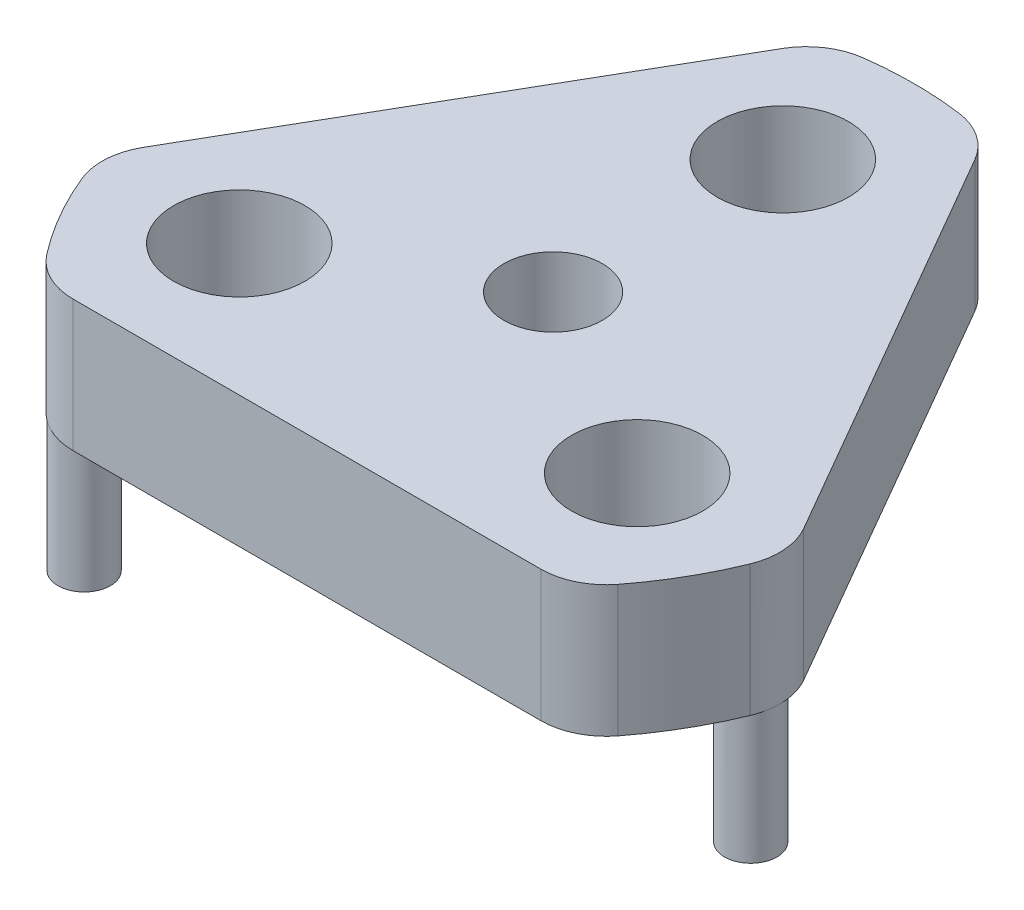
ISO-10303-21;
HEADER;
FILE_DESCRIPTION(('STEP AP214'),'2;1');
FILE_NAME('part.step','',(''),(''),'','','');
FILE_SCHEMA(('AUTOMOTIVE_DESIGN { 1 0 10303 214 1 1 1 1 }'));
ENDSEC;
DATA;
#1=APPLICATION_CONTEXT('core data for automotive mechanical design processes');
#2=APPLICATION_PROTOCOL_DEFINITION('international standard','automotive_design',2000,#1);
#3=PRODUCT_CONTEXT('',#1,'mechanical');
#4=PRODUCT('Part','Part','',(#3));
#5=PRODUCT_RELATED_PRODUCT_CATEGORY('part','',(#4));
#6=PRODUCT_DEFINITION_FORMATION('','',#4);
#7=PRODUCT_DEFINITION_CONTEXT('part definition',#1,'design');
#8=PRODUCT_DEFINITION('design','',#6,#7);
#9=PRODUCT_DEFINITION_SHAPE('','',#8);
#10=(LENGTH_UNIT() NAMED_UNIT(*) SI_UNIT(.MILLI.,.METRE.));
#11=(NAMED_UNIT(*) PLANE_ANGLE_UNIT() SI_UNIT($,.RADIAN.));
#12=(NAMED_UNIT(*) SI_UNIT($,.STERADIAN.) SOLID_ANGLE_UNIT());
#13=UNCERTAINTY_MEASURE_WITH_UNIT(LENGTH_MEASURE(1.E-05),#10,'distance_accuracy_value','');
#14=(GEOMETRIC_REPRESENTATION_CONTEXT(3) GLOBAL_UNCERTAINTY_ASSIGNED_CONTEXT((#13)) GLOBAL_UNIT_ASSIGNED_CONTEXT((#10,
#11,#12)) REPRESENTATION_CONTEXT('',''));
#15=CARTESIAN_POINT('',(0.,0.,0.));
#16=DIRECTION('',(0.,0.,1.));
#17=DIRECTION('',(1.,0.,0.));
#18=AXIS2_PLACEMENT_3D('',#15,#16,#17);
#19=CARTESIAN_POINT('',(0.,10.,18.75));
#20=DIRECTION('',(0.,0.,-1.));
#21=DIRECTION('',(-1.,0.,0.));
#22=AXIS2_PLACEMENT_3D('',#19,#20,#21);
#23=PLANE('',#22);
#24=DIRECTION('',(1.,0.,0.));
#25=VECTOR('',#24,1.);
#26=CARTESIAN_POINT('',(0.,0.,18.75));
#27=LINE('',#26,#25);
#28=CARTESIAN_POINT('',(-17.8097585609688,0.,18.75));
#29=VERTEX_POINT('',#28);
#30=CARTESIAN_POINT('',(17.8097585609688,0.,18.75));
#31=VERTEX_POINT('',#30);
#32=EDGE_CURVE('E145',#29,#31,#27,.T.);
#33=ORIENTED_EDGE('',*,*,#32,.T.);
#34=DIRECTION('',(0.,-1.,0.));
#35=VECTOR('',#34,1.);
#36=CARTESIAN_POINT('',(17.8097585609688,10.,18.75));
#37=LINE('',#36,#35);
#38=CARTESIAN_POINT('',(17.8097585609688,10.,18.75));
#39=VERTEX_POINT('',#38);
#40=EDGE_CURVE('E199',#31,#39,#37,.F.);
#41=ORIENTED_EDGE('',*,*,#40,.T.);
#42=DIRECTION('',(1.,0.,0.));
#43=VECTOR('',#42,1.);
#44=CARTESIAN_POINT('',(0.,10.,18.75));
#45=LINE('',#44,#43);
#46=CARTESIAN_POINT('',(-17.8097585609688,10.,18.75));
#47=VERTEX_POINT('',#46);
#48=EDGE_CURVE('E204',#47,#39,#45,.T.);
#49=ORIENTED_EDGE('',*,*,#48,.F.);
#50=DIRECTION('',(0.,-1.,0.));
#51=VECTOR('',#50,1.);
#52=CARTESIAN_POINT('',(-17.8097585609688,10.,18.75));
#53=LINE('',#52,#51);
#54=EDGE_CURVE('E197',#47,#29,#53,.T.);
#55=ORIENTED_EDGE('',*,*,#54,.T.);
#56=EDGE_LOOP('',(#33,#41,#49,#55));
#57=FACE_BOUND('',#56,.T.);
#58=ADVANCED_FACE('F39',(#57),#23,.F.);
#59=CARTESIAN_POINT('',(0.,10.,0.));
#60=DIRECTION('',(0.,-1.,0.));
#61=DIRECTION('',(0.,0.,-1.));
#62=AXIS2_PLACEMENT_3D('',#59,#60,#61);
#63=CYLINDRICAL_SURFACE('',#62,27.5);
#64=CARTESIAN_POINT('',(0.,0.,0.));
#65=DIRECTION('',(0.,1.,0.));
#66=DIRECTION('',(0.,0.,1.));
#67=AXIS2_PLACEMENT_3D('',#64,#65,#66);
#68=CIRCLE('',#67,27.5);
#69=CARTESIAN_POINT('',(21.7674826856285,0.,16.8055555555556));
#70=VERTEX_POINT('',#69);
#71=CARTESIAN_POINT('',(25.4377793786361,0.,10.4484152044144));
#72=VERTEX_POINT('',#71);
#73=EDGE_CURVE('E221',#70,#72,#68,.T.);
#74=ORIENTED_EDGE('',*,*,#73,.T.);
#75=DIRECTION('',(0.,-1.,0.));
#76=VECTOR('',#75,1.);
#77=CARTESIAN_POINT('',(25.4377793786361,10.,10.4484152044144));
#78=LINE('',#77,#76);
#79=CARTESIAN_POINT('',(25.4377793786361,10.,10.4484152044144));
#80=VERTEX_POINT('',#79);
#81=EDGE_CURVE('E195',#72,#80,#78,.F.);
#82=ORIENTED_EDGE('',*,*,#81,.T.);
#83=CARTESIAN_POINT('',(0.,10.,0.));
#84=DIRECTION('',(0.,1.,0.));
#85=DIRECTION('',(0.,0.,1.));
#86=AXIS2_PLACEMENT_3D('',#83,#84,#85);
#87=CIRCLE('',#86,27.5);
#88=CARTESIAN_POINT('',(21.7674826856285,10.,16.8055555555556));
#89=VERTEX_POINT('',#88);
#90=EDGE_CURVE('E212',#89,#80,#87,.T.);
#91=ORIENTED_EDGE('',*,*,#90,.F.);
#92=DIRECTION('',(0.,-1.,0.));
#93=VECTOR('',#92,1.);
#94=CARTESIAN_POINT('',(21.7674826856285,10.,16.8055555555556));
#95=LINE('',#94,#93);
#96=EDGE_CURVE('E192',#89,#70,#95,.T.);
#97=ORIENTED_EDGE('',*,*,#96,.T.);
#98=EDGE_LOOP('',(#74,#82,#91,#97));
#99=FACE_BOUND('',#98,.T.);
#100=ADVANCED_FACE('F220',(#99),#63,.T.);
#101=CARTESIAN_POINT('',(16.2379763209582,10.,-9.37500000000001));
#102=DIRECTION('',(0.866025403784438,0.,-0.5));
#103=DIRECTION('',(-0.5,0.,-0.866025403784438));
#104=AXIS2_PLACEMENT_3D('',#101,#102,#103);
#105=PLANE('',#104);
#106=DIRECTION('',(0.5,0.,0.866025403784439));
#107=VECTOR('',#106,1.);
#108=CARTESIAN_POINT('',(16.2379763209582,0.,-9.37500000000001));
#109=LINE('',#108,#107);
#110=CARTESIAN_POINT('',(7.33309704047385,0.,-24.7987033490663));
#111=VERTEX_POINT('',#110);
#112=CARTESIAN_POINT('',(25.1428556014426,0.,6.04870334906632));
#113=VERTEX_POINT('',#112);
#114=EDGE_CURVE('E225',#111,#113,#109,.T.);
#115=ORIENTED_EDGE('',*,*,#114,.F.);
#116=DIRECTION('',(0.,1.,0.));
#117=VECTOR('',#116,1.);
#118=CARTESIAN_POINT('',(7.33309704047385,10.,-24.7987033490663));
#119=LINE('',#118,#117);
#120=CARTESIAN_POINT('',(7.33309704047385,10.,-24.7987033490663));
#121=VERTEX_POINT('',#120);
#122=EDGE_CURVE('E190',#111,#121,#119,.T.);
#123=ORIENTED_EDGE('',*,*,#122,.T.);
#124=DIRECTION('',(0.5,0.,0.866025403784439));
#125=VECTOR('',#124,1.);
#126=CARTESIAN_POINT('',(16.2379763209582,10.,-9.37500000000001));
#127=LINE('',#126,#125);
#128=CARTESIAN_POINT('',(25.1428556014426,10.,6.04870334906632));
#129=VERTEX_POINT('',#128);
#130=EDGE_CURVE('E354',#121,#129,#127,.T.);
#131=ORIENTED_EDGE('',*,*,#130,.T.);
#132=DIRECTION('',(0.,1.,0.));
#133=VECTOR('',#132,1.);
#134=CARTESIAN_POINT('',(25.1428556014426,0.,6.04870334906631));
#135=LINE('',#134,#133);
#136=EDGE_CURVE('E187',#129,#113,#135,.F.);
#137=ORIENTED_EDGE('',*,*,#136,.T.);
#138=EDGE_LOOP('',(#115,#123,#131,#137));
#139=FACE_BOUND('',#138,.T.);
#140=ADVANCED_FACE('F291',(#139),#105,.T.);
#141=CARTESIAN_POINT('',(3.67029669300758,0.,-27.25397075997));
#142=VERTEX_POINT('',#141);
#143=CARTESIAN_POINT('',(-3.67029669300758,0.,-27.25397075997));
#144=VERTEX_POINT('',#143);
#145=EDGE_CURVE('E227',#142,#144,#68,.T.);
#146=ORIENTED_EDGE('',*,*,#145,.T.);
#147=DIRECTION('',(0.,-1.,0.));
#148=VECTOR('',#147,1.);
#149=CARTESIAN_POINT('',(-3.67029669300758,10.,-27.25397075997));
#150=LINE('',#149,#148);
#151=CARTESIAN_POINT('',(-3.67029669300758,10.,-27.25397075997));
#152=VERTEX_POINT('',#151);
#153=EDGE_CURVE('E174',#144,#152,#150,.F.);
#154=ORIENTED_EDGE('',*,*,#153,.T.);
#155=CARTESIAN_POINT('',(3.67029669300758,10.,-27.25397075997));
#156=VERTEX_POINT('',#155);
#157=EDGE_CURVE('E253',#156,#152,#87,.T.);
#158=ORIENTED_EDGE('',*,*,#157,.F.);
#159=DIRECTION('',(0.,-1.,0.));
#160=VECTOR('',#159,1.);
#161=CARTESIAN_POINT('',(3.67029669300758,10.,-27.25397075997));
#162=LINE('',#161,#160);
#163=EDGE_CURVE('E171',#156,#142,#162,.T.);
#164=ORIENTED_EDGE('',*,*,#163,.T.);
#165=EDGE_LOOP('',(#146,#154,#158,#164));
#166=FACE_BOUND('',#165,.T.);
#167=ADVANCED_FACE('F283',(#166),#63,.T.);
#168=CARTESIAN_POINT('',(-16.2379763209582,10.,-9.37500000000001));
#169=DIRECTION('',(0.866025403784438,0.,0.5));
#170=DIRECTION('',(0.5,0.,-0.866025403784438));
#171=AXIS2_PLACEMENT_3D('',#168,#169,#170);
#172=PLANE('',#171);
#173=DIRECTION('',(-0.5,0.,0.866025403784438));
#174=VECTOR('',#173,1.);
#175=CARTESIAN_POINT('',(-16.2379763209582,10.,-9.37500000000001));
#176=LINE('',#175,#174);
#177=CARTESIAN_POINT('',(-7.33309704047385,10.,-24.7987033490663));
#178=VERTEX_POINT('',#177);
#179=CARTESIAN_POINT('',(-25.1428556014426,10.,6.04870334906631));
#180=VERTEX_POINT('',#179);
#181=EDGE_CURVE('E251',#178,#180,#176,.T.);
#182=ORIENTED_EDGE('',*,*,#181,.F.);
#183=DIRECTION('',(0.,-1.,0.));
#184=VECTOR('',#183,1.);
#185=CARTESIAN_POINT('',(-7.33309704047385,10.,-24.7987033490663));
#186=LINE('',#185,#184);
#187=CARTESIAN_POINT('',(-7.33309704047385,0.,-24.7987033490663));
#188=VERTEX_POINT('',#187);
#189=EDGE_CURVE('E154',#178,#188,#186,.T.);
#190=ORIENTED_EDGE('',*,*,#189,.T.);
#191=DIRECTION('',(-0.5,0.,0.866025403784438));
#192=VECTOR('',#191,1.);
#193=CARTESIAN_POINT('',(-16.2379763209582,0.,-9.37500000000001));
#194=LINE('',#193,#192);
#195=CARTESIAN_POINT('',(-25.1428556014426,0.,6.04870334906631));
#196=VERTEX_POINT('',#195);
#197=EDGE_CURVE('E234',#188,#196,#194,.T.);
#198=ORIENTED_EDGE('',*,*,#197,.T.);
#199=DIRECTION('',(0.,-1.,0.));
#200=VECTOR('',#199,1.);
#201=CARTESIAN_POINT('',(-25.1428556014426,10.,6.04870334906631));
#202=LINE('',#201,#200);
#203=EDGE_CURVE('E156',#196,#180,#202,.F.);
#204=ORIENTED_EDGE('',*,*,#203,.T.);
#205=EDGE_LOOP('',(#182,#190,#198,#204));
#206=FACE_BOUND('',#205,.T.);
#207=ADVANCED_FACE('F281',(#206),#172,.F.);
#208=CARTESIAN_POINT('',(-25.4377793786361,10.,10.4484152044144));
#209=VERTEX_POINT('',#208);
#210=CARTESIAN_POINT('',(-21.7674826856285,10.,16.8055555555556));
#211=VERTEX_POINT('',#210);
#212=EDGE_CURVE('E247',#209,#211,#87,.T.);
#213=ORIENTED_EDGE('',*,*,#212,.F.);
#214=DIRECTION('',(0.,-1.,0.));
#215=VECTOR('',#214,1.);
#216=CARTESIAN_POINT('',(-25.4377793786361,10.,10.4484152044144));
#217=LINE('',#216,#215);
#218=CARTESIAN_POINT('',(-25.4377793786361,0.,10.4484152044144));
#219=VERTEX_POINT('',#218);
#220=EDGE_CURVE('E11',#209,#219,#217,.T.);
#221=ORIENTED_EDGE('',*,*,#220,.T.);
#222=CARTESIAN_POINT('',(-21.7674826856285,0.,16.8055555555556));
#223=VERTEX_POINT('',#222);
#224=EDGE_CURVE('E228',#219,#223,#68,.T.);
#225=ORIENTED_EDGE('',*,*,#224,.T.);
#226=DIRECTION('',(0.,-1.,0.));
#227=VECTOR('',#226,1.);
#228=CARTESIAN_POINT('',(-21.7674826856285,10.,16.8055555555556));
#229=LINE('',#228,#227);
#230=EDGE_CURVE('E47',#223,#211,#229,.F.);
#231=ORIENTED_EDGE('',*,*,#230,.T.);
#232=EDGE_LOOP('',(#213,#221,#225,#231));
#233=FACE_BOUND('',#232,.T.);
#234=ADVANCED_FACE('F271',(#233),#63,.T.);
#235=CARTESIAN_POINT('',(15.1554445662277,10.,8.75));
#236=DIRECTION('',(0.,-1.,0.));
#237=DIRECTION('',(0.,0.,-1.));
#238=AXIS2_PLACEMENT_3D('',#235,#236,#237);
#239=CYLINDRICAL_SURFACE('',#238,5.00000000000001);
#240=CARTESIAN_POINT('',(15.1554445662277,10.,8.75));
#241=DIRECTION('',(0.,1.,0.));
#242=DIRECTION('',(0.,0.,1.));
#243=AXIS2_PLACEMENT_3D('',#240,#241,#242);
#244=CIRCLE('',#243,5.00000000000001);
#245=CARTESIAN_POINT('',(15.1554445662277,10.,13.75));
#246=VERTEX_POINT('',#245);
#247=EDGE_CURVE('E213',#246,#246,#244,.T.);
#248=ORIENTED_EDGE('',*,*,#247,.T.);
#249=EDGE_LOOP('',(#248));
#250=FACE_BOUND('',#249,.T.);
#251=CARTESIAN_POINT('',(15.1554445662277,0.,8.75));
#252=DIRECTION('',(0.,1.,0.));
#253=DIRECTION('',(0.,0.,1.));
#254=AXIS2_PLACEMENT_3D('',#251,#252,#253);
#255=CIRCLE('',#254,5.00000000000001);
#256=CARTESIAN_POINT('',(15.1554445662277,0.,13.75));
#257=VERTEX_POINT('',#256);
#258=EDGE_CURVE('E231',#257,#257,#255,.T.);
#259=ORIENTED_EDGE('',*,*,#258,.F.);
#260=EDGE_LOOP('',(#259));
#261=FACE_BOUND('',#260,.T.);
#262=ADVANCED_FACE('F268',(#250,#261),#239,.F.);
#263=CARTESIAN_POINT('',(-15.1554445662277,10.,8.75));
#264=DIRECTION('',(0.,-1.,0.));
#265=DIRECTION('',(0.,0.,-1.));
#266=AXIS2_PLACEMENT_3D('',#263,#264,#265);
#267=CYLINDRICAL_SURFACE('',#266,5.);
#268=CARTESIAN_POINT('',(-15.1554445662277,10.,8.75));
#269=DIRECTION('',(0.,1.,0.));
#270=DIRECTION('',(0.,0.,1.));
#271=AXIS2_PLACEMENT_3D('',#268,#269,#270);
#272=CIRCLE('',#271,5.);
#273=CARTESIAN_POINT('',(-15.1554445662277,10.,13.75));
#274=VERTEX_POINT('',#273);
#275=EDGE_CURVE('E351',#274,#274,#272,.T.);
#276=ORIENTED_EDGE('',*,*,#275,.T.);
#277=EDGE_LOOP('',(#276));
#278=FACE_BOUND('',#277,.T.);
#279=CARTESIAN_POINT('',(-15.1554445662277,0.,8.75));
#280=DIRECTION('',(0.,1.,0.));
#281=DIRECTION('',(0.,0.,1.));
#282=AXIS2_PLACEMENT_3D('',#279,#280,#281);
#283=CIRCLE('',#282,5.);
#284=CARTESIAN_POINT('',(-15.1554445662277,0.,13.75));
#285=VERTEX_POINT('',#284);
#286=EDGE_CURVE('E260',#285,#285,#283,.T.);
#287=ORIENTED_EDGE('',*,*,#286,.F.);
#288=EDGE_LOOP('',(#287));
#289=FACE_BOUND('',#288,.T.);
#290=ADVANCED_FACE('F270',(#278,#289),#267,.F.);
#291=CARTESIAN_POINT('',(0.,10.,-17.5));
#292=DIRECTION('',(0.,-1.,0.));
#293=DIRECTION('',(0.,0.,-1.));
#294=AXIS2_PLACEMENT_3D('',#291,#292,#293);
#295=CYLINDRICAL_SURFACE('',#294,5.);
#296=CARTESIAN_POINT('',(0.,10.,-17.5));
#297=DIRECTION('',(0.,1.,0.));
#298=DIRECTION('',(0.,0.,1.));
#299=AXIS2_PLACEMENT_3D('',#296,#297,#298);
#300=CIRCLE('',#299,5.);
#301=CARTESIAN_POINT('',(0.,10.,-12.5));
#302=VERTEX_POINT('',#301);
#303=EDGE_CURVE('E237',#302,#302,#300,.T.);
#304=ORIENTED_EDGE('',*,*,#303,.T.);
#305=EDGE_LOOP('',(#304));
#306=FACE_BOUND('',#305,.T.);
#307=CARTESIAN_POINT('',(0.,0.,-17.5));
#308=DIRECTION('',(0.,1.,0.));
#309=DIRECTION('',(0.,0.,1.));
#310=AXIS2_PLACEMENT_3D('',#307,#308,#309);
#311=CIRCLE('',#310,5.);
#312=CARTESIAN_POINT('',(0.,0.,-12.5));
#313=VERTEX_POINT('',#312);
#314=EDGE_CURVE('E257',#313,#313,#311,.T.);
#315=ORIENTED_EDGE('',*,*,#314,.F.);
#316=EDGE_LOOP('',(#315));
#317=FACE_BOUND('',#316,.T.);
#318=ADVANCED_FACE('F277',(#306,#317),#295,.F.);
#319=CARTESIAN_POINT('',(0.,10.,0.));
#320=DIRECTION('',(0.,-1.,0.));
#321=DIRECTION('',(0.,0.,-1.));
#322=AXIS2_PLACEMENT_3D('',#319,#320,#321);
#323=CYLINDRICAL_SURFACE('',#322,3.75);
#324=CARTESIAN_POINT('',(0.,10.,0.));
#325=DIRECTION('',(0.,1.,0.));
#326=DIRECTION('',(0.,0.,1.));
#327=AXIS2_PLACEMENT_3D('',#324,#325,#326);
#328=CIRCLE('',#327,3.75);
#329=CARTESIAN_POINT('',(0.,10.,3.75));
#330=VERTEX_POINT('',#329);
#331=EDGE_CURVE('E244',#330,#330,#328,.T.);
#332=ORIENTED_EDGE('',*,*,#331,.T.);
#333=EDGE_LOOP('',(#332));
#334=FACE_BOUND('',#333,.T.);
#335=CARTESIAN_POINT('',(0.,0.,0.));
#336=DIRECTION('',(0.,1.,0.));
#337=DIRECTION('',(0.,0.,1.));
#338=AXIS2_PLACEMENT_3D('',#335,#336,#337);
#339=CIRCLE('',#338,3.75);
#340=CARTESIAN_POINT('',(0.,0.,3.75));
#341=VERTEX_POINT('',#340);
#342=EDGE_CURVE('E235',#341,#341,#339,.T.);
#343=ORIENTED_EDGE('',*,*,#342,.F.);
#344=EDGE_LOOP('',(#343));
#345=FACE_BOUND('',#344,.T.);
#346=ADVANCED_FACE('F298',(#334,#345),#323,.F.);
#347=CARTESIAN_POINT('',(0.,10.,0.));
#348=DIRECTION('',(0.,1.,0.));
#349=DIRECTION('',(0.,0.,1.));
#350=AXIS2_PLACEMENT_3D('',#347,#348,#349);
#351=PLANE('',#350);
#352=ORIENTED_EDGE('',*,*,#303,.F.);
#353=EDGE_LOOP('',(#352));
#354=FACE_BOUND('',#353,.T.);
#355=ORIENTED_EDGE('',*,*,#275,.F.);
#356=EDGE_LOOP('',(#355));
#357=FACE_BOUND('',#356,.T.);
#358=ORIENTED_EDGE('',*,*,#247,.F.);
#359=EDGE_LOOP('',(#358));
#360=FACE_BOUND('',#359,.T.);
#361=ORIENTED_EDGE('',*,*,#157,.T.);
#362=CARTESIAN_POINT('',(-3.00297002155166,10.,-22.2987033490663));
#363=DIRECTION('',(0.,1.,0.));
#364=DIRECTION('',(0.,0.,1.));
#365=AXIS2_PLACEMENT_3D('',#362,#363,#364);
#366=CIRCLE('',#365,5.);
#367=EDGE_CURVE('E185',#152,#178,#366,.T.);
#368=ORIENTED_EDGE('',*,*,#367,.T.);
#369=ORIENTED_EDGE('',*,*,#181,.T.);
#370=CARTESIAN_POINT('',(-20.8127285825204,10.,8.54870334906632));
#371=DIRECTION('',(0.,1.,0.));
#372=DIRECTION('',(0.,0.,1.));
#373=AXIS2_PLACEMENT_3D('',#370,#371,#372);
#374=CIRCLE('',#373,5.);
#375=EDGE_CURVE('E60',#180,#209,#374,.T.);
#376=ORIENTED_EDGE('',*,*,#375,.T.);
#377=ORIENTED_EDGE('',*,*,#212,.T.);
#378=CARTESIAN_POINT('',(-17.8097585609688,10.,13.75));
#379=DIRECTION('',(0.,1.,0.));
#380=DIRECTION('',(0.,0.,1.));
#381=AXIS2_PLACEMENT_3D('',#378,#379,#380);
#382=CIRCLE('',#381,5.);
#383=EDGE_CURVE('E176',#211,#47,#382,.T.);
#384=ORIENTED_EDGE('',*,*,#383,.T.);
#385=ORIENTED_EDGE('',*,*,#48,.T.);
#386=CARTESIAN_POINT('',(17.8097585609688,10.,13.75));
#387=DIRECTION('',(0.,1.,0.));
#388=DIRECTION('',(0.,0.,1.));
#389=AXIS2_PLACEMENT_3D('',#386,#387,#388);
#390=CIRCLE('',#389,5.);
#391=EDGE_CURVE('E179',#39,#89,#390,.T.);
#392=ORIENTED_EDGE('',*,*,#391,.T.);
#393=ORIENTED_EDGE('',*,*,#90,.T.);
#394=CARTESIAN_POINT('',(20.8127285825204,10.,8.54870334906632));
#395=DIRECTION('',(0.,1.,0.));
#396=DIRECTION('',(0.,0.,1.));
#397=AXIS2_PLACEMENT_3D('',#394,#395,#396);
#398=CIRCLE('',#397,5.);
#399=EDGE_CURVE('E181',#80,#129,#398,.T.);
#400=ORIENTED_EDGE('',*,*,#399,.T.);
#401=ORIENTED_EDGE('',*,*,#130,.F.);
#402=CARTESIAN_POINT('',(3.00297002155166,10.,-22.2987033490663));
#403=DIRECTION('',(0.,1.,0.));
#404=DIRECTION('',(0.,0.,1.));
#405=AXIS2_PLACEMENT_3D('',#402,#403,#404);
#406=CIRCLE('',#405,5.);
#407=EDGE_CURVE('E183',#121,#156,#406,.T.);
#408=ORIENTED_EDGE('',*,*,#407,.T.);
#409=EDGE_LOOP('',(#361,#368,#369,#376,#377,#384,#385,#392,#393,#400,#401,#408));
#410=FACE_BOUND('',#409,.T.);
#411=ORIENTED_EDGE('',*,*,#331,.F.);
#412=EDGE_LOOP('',(#411));
#413=FACE_BOUND('',#412,.T.);
#414=ADVANCED_FACE('F208',(#354,#357,#360,#410,#413),#351,.T.);
#415=CARTESIAN_POINT('',(0.,0.,0.));
#416=DIRECTION('',(0.,1.,0.));
#417=DIRECTION('',(0.,0.,1.));
#418=AXIS2_PLACEMENT_3D('',#415,#416,#417);
#419=PLANE('',#418);
#420=ORIENTED_EDGE('',*,*,#314,.T.);
#421=EDGE_LOOP('',(#420));
#422=FACE_BOUND('',#421,.T.);
#423=ORIENTED_EDGE('',*,*,#286,.T.);
#424=EDGE_LOOP('',(#423));
#425=FACE_BOUND('',#424,.T.);
#426=ORIENTED_EDGE('',*,*,#258,.T.);
#427=EDGE_LOOP('',(#426));
#428=FACE_BOUND('',#427,.T.);
#429=CARTESIAN_POINT('',(20.8127285825204,0.,8.54870334906632));
#430=DIRECTION('',(0.,1.,0.));
#431=DIRECTION('',(0.,0.,1.));
#432=AXIS2_PLACEMENT_3D('',#429,#430,#431);
#433=CIRCLE('',#432,5.);
#434=CARTESIAN_POINT('',(25.8014602344878,0.,8.88419776728912));
#435=VERTEX_POINT('',#434);
#436=EDGE_CURVE('E164',#113,#435,#433,.F.);
#437=ORIENTED_EDGE('',*,*,#436,.T.);
#438=CARTESIAN_POINT('',(23.8059675737009,0.,8.75));
#439=DIRECTION('',(0.,-1.,0.));
#440=DIRECTION('',(0.,0.,-1.));
#441=AXIS2_PLACEMENT_3D('',#438,#439,#440);
#442=CIRCLE('',#441,2.);
#443=EDGE_CURVE('E334',#435,#435,#442,.T.);
#444=ORIENTED_EDGE('',*,*,#443,.F.);
#445=EDGE_CURVE('E163',#435,#72,#433,.F.);
#446=ORIENTED_EDGE('',*,*,#445,.T.);
#447=ORIENTED_EDGE('',*,*,#73,.F.);
#448=CARTESIAN_POINT('',(17.8097585609688,0.,13.75));
#449=DIRECTION('',(0.,1.,0.));
#450=DIRECTION('',(0.,0.,1.));
#451=AXIS2_PLACEMENT_3D('',#448,#449,#450);
#452=CIRCLE('',#451,5.);
#453=EDGE_CURVE('E161',#70,#31,#452,.F.);
#454=ORIENTED_EDGE('',*,*,#453,.T.);
#455=ORIENTED_EDGE('',*,*,#32,.F.);
#456=CARTESIAN_POINT('',(-17.8097585609688,0.,13.75));
#457=DIRECTION('',(0.,1.,0.));
#458=DIRECTION('',(0.,0.,1.));
#459=AXIS2_PLACEMENT_3D('',#456,#457,#458);
#460=CIRCLE('',#459,5.);
#461=CARTESIAN_POINT('',(-20.5946710759613,0.,17.9026211341559));
#462=VERTEX_POINT('',#461);
#463=EDGE_CURVE('E138',#29,#462,#460,.F.);
#464=ORIENTED_EDGE('',*,*,#463,.T.);
#465=CARTESIAN_POINT('',(-19.4807060699643,0.,16.2415726804936));
#466=DIRECTION('',(0.,-1.,0.));
#467=DIRECTION('',(0.,0.,-1.));
#468=AXIS2_PLACEMENT_3D('',#465,#466,#467);
#469=CIRCLE('',#468,2.);
#470=EDGE_CURVE('E143',#462,#462,#469,.T.);
#471=ORIENTED_EDGE('',*,*,#470,.F.);
#472=EDGE_CURVE('E150',#462,#223,#460,.F.);
#473=ORIENTED_EDGE('',*,*,#472,.T.);
#474=ORIENTED_EDGE('',*,*,#224,.F.);
#475=CARTESIAN_POINT('',(-20.8127285825204,0.,8.54870334906632));
#476=DIRECTION('',(0.,1.,0.));
#477=DIRECTION('',(0.,0.,1.));
#478=AXIS2_PLACEMENT_3D('',#475,#476,#477);
#479=CIRCLE('',#478,5.);
#480=EDGE_CURVE('E149',#219,#196,#479,.F.);
#481=ORIENTED_EDGE('',*,*,#480,.T.);
#482=ORIENTED_EDGE('',*,*,#197,.F.);
#483=CARTESIAN_POINT('',(-3.00297002155166,0.,-22.2987033490663));
#484=DIRECTION('',(0.,1.,0.));
#485=DIRECTION('',(0.,0.,1.));
#486=AXIS2_PLACEMENT_3D('',#483,#484,#485);
#487=CIRCLE('',#486,5.);
#488=CARTESIAN_POINT('',(-5.20678915852654,0.,-26.786818901445));
#489=VERTEX_POINT('',#488);
#490=EDGE_CURVE('E169',#188,#489,#487,.F.);
#491=ORIENTED_EDGE('',*,*,#490,.T.);
#492=CARTESIAN_POINT('',(-4.32526150373659,0.,-24.9915726804935));
#493=DIRECTION('',(0.,-1.,0.));
#494=DIRECTION('',(0.,0.,-1.));
#495=AXIS2_PLACEMENT_3D('',#492,#493,#494);
#496=CIRCLE('',#495,2.);
#497=EDGE_CURVE('E337',#489,#489,#496,.T.);
#498=ORIENTED_EDGE('',*,*,#497,.F.);
#499=EDGE_CURVE('E168',#489,#144,#487,.F.);
#500=ORIENTED_EDGE('',*,*,#499,.T.);
#501=ORIENTED_EDGE('',*,*,#145,.F.);
#502=CARTESIAN_POINT('',(3.00297002155166,0.,-22.2987033490663));
#503=DIRECTION('',(0.,1.,0.));
#504=DIRECTION('',(0.,0.,1.));
#505=AXIS2_PLACEMENT_3D('',#502,#503,#504);
#506=CIRCLE('',#505,5.);
#507=EDGE_CURVE('E166',#142,#111,#506,.F.);
#508=ORIENTED_EDGE('',*,*,#507,.T.);
#509=ORIENTED_EDGE('',*,*,#114,.T.);
#510=EDGE_LOOP('',(#437,#444,#446,#447,#454,#455,#464,#471,#473,#474,#481,#482,#491,#498,#500,
#501,#508,#509));
#511=FACE_BOUND('',#510,.T.);
#512=ORIENTED_EDGE('',*,*,#342,.T.);
#513=EDGE_LOOP('',(#512));
#514=FACE_BOUND('',#513,.T.);
#515=ADVANCED_FACE('F140',(#422,#425,#428,#511,#514),#419,.F.);
#516=CARTESIAN_POINT('',(-3.00297002155166,10.,-22.2987033490663));
#517=DIRECTION('',(0.,-1.,0.));
#518=DIRECTION('',(0.,0.,-1.));
#519=AXIS2_PLACEMENT_3D('',#516,#517,#518);
#520=CYLINDRICAL_SURFACE('',#519,5.);
#521=ORIENTED_EDGE('',*,*,#367,.F.);
#522=ORIENTED_EDGE('',*,*,#153,.F.);
#523=ORIENTED_EDGE('',*,*,#499,.F.);
#524=ORIENTED_EDGE('',*,*,#490,.F.);
#525=ORIENTED_EDGE('',*,*,#189,.F.);
#526=EDGE_LOOP('',(#521,#522,#523,#524,#525));
#527=FACE_BOUND('',#526,.T.);
#528=ADVANCED_FACE('F302',(#527),#520,.T.);
#529=CARTESIAN_POINT('',(3.00297002155166,10.,-22.2987033490663));
#530=DIRECTION('',(0.,-1.,0.));
#531=DIRECTION('',(0.,0.,-1.));
#532=AXIS2_PLACEMENT_3D('',#529,#530,#531);
#533=CYLINDRICAL_SURFACE('',#532,5.);
#534=ORIENTED_EDGE('',*,*,#407,.F.);
#535=ORIENTED_EDGE('',*,*,#122,.F.);
#536=ORIENTED_EDGE('',*,*,#507,.F.);
#537=ORIENTED_EDGE('',*,*,#163,.F.);
#538=EDGE_LOOP('',(#534,#535,#536,#537));
#539=FACE_BOUND('',#538,.T.);
#540=ADVANCED_FACE('F367',(#539),#533,.T.);
#541=CARTESIAN_POINT('',(20.8127285825204,10.,8.54870334906632));
#542=DIRECTION('',(0.,-1.,0.));
#543=DIRECTION('',(0.,0.,-1.));
#544=AXIS2_PLACEMENT_3D('',#541,#542,#543);
#545=CYLINDRICAL_SURFACE('',#544,5.);
#546=ORIENTED_EDGE('',*,*,#399,.F.);
#547=ORIENTED_EDGE('',*,*,#81,.F.);
#548=ORIENTED_EDGE('',*,*,#445,.F.);
#549=ORIENTED_EDGE('',*,*,#436,.F.);
#550=ORIENTED_EDGE('',*,*,#136,.F.);
#551=EDGE_LOOP('',(#546,#547,#548,#549,#550));
#552=FACE_BOUND('',#551,.T.);
#553=ADVANCED_FACE('F360',(#552),#545,.T.);
#554=CARTESIAN_POINT('',(17.8097585609688,10.,13.75));
#555=DIRECTION('',(0.,-1.,0.));
#556=DIRECTION('',(0.,0.,-1.));
#557=AXIS2_PLACEMENT_3D('',#554,#555,#556);
#558=CYLINDRICAL_SURFACE('',#557,5.);
#559=ORIENTED_EDGE('',*,*,#391,.F.);
#560=ORIENTED_EDGE('',*,*,#40,.F.);
#561=ORIENTED_EDGE('',*,*,#453,.F.);
#562=ORIENTED_EDGE('',*,*,#96,.F.);
#563=EDGE_LOOP('',(#559,#560,#561,#562));
#564=FACE_BOUND('',#563,.T.);
#565=ADVANCED_FACE('F216',(#564),#558,.T.);
#566=CARTESIAN_POINT('',(-20.8127285825204,10.,8.54870334906632));
#567=DIRECTION('',(0.,-1.,0.));
#568=DIRECTION('',(0.,0.,-1.));
#569=AXIS2_PLACEMENT_3D('',#566,#567,#568);
#570=CYLINDRICAL_SURFACE('',#569,5.);
#571=ORIENTED_EDGE('',*,*,#375,.F.);
#572=ORIENTED_EDGE('',*,*,#203,.F.);
#573=ORIENTED_EDGE('',*,*,#480,.F.);
#574=ORIENTED_EDGE('',*,*,#220,.F.);
#575=EDGE_LOOP('',(#571,#572,#573,#574));
#576=FACE_BOUND('',#575,.T.);
#577=ADVANCED_FACE('F378',(#576),#570,.T.);
#578=CARTESIAN_POINT('',(-17.8097585609688,10.,13.75));
#579=DIRECTION('',(0.,-1.,0.));
#580=DIRECTION('',(0.,0.,-1.));
#581=AXIS2_PLACEMENT_3D('',#578,#579,#580);
#582=CYLINDRICAL_SURFACE('',#581,5.);
#583=ORIENTED_EDGE('',*,*,#383,.F.);
#584=ORIENTED_EDGE('',*,*,#230,.F.);
#585=ORIENTED_EDGE('',*,*,#472,.F.);
#586=ORIENTED_EDGE('',*,*,#463,.F.);
#587=ORIENTED_EDGE('',*,*,#54,.F.);
#588=EDGE_LOOP('',(#583,#584,#585,#586,#587));
#589=FACE_BOUND('',#588,.T.);
#590=ADVANCED_FACE('F41',(#589),#582,.T.);
#591=CARTESIAN_POINT('',(-19.4807060699643,-10.,16.2415726804936));
#592=DIRECTION('',(0.,1.,0.));
#593=DIRECTION('',(0.,0.,1.));
#594=AXIS2_PLACEMENT_3D('',#591,#592,#593);
#595=CYLINDRICAL_SURFACE('',#594,2.);
#596=CARTESIAN_POINT('',(-19.4807060699643,-10.,16.2415726804936));
#597=DIRECTION('',(0.,-1.,0.));
#598=DIRECTION('',(0.,0.,-1.));
#599=AXIS2_PLACEMENT_3D('',#596,#597,#598);
#600=CIRCLE('',#599,2.);
#601=CARTESIAN_POINT('',(-19.4807060699643,-10.,14.2415726804936));
#602=VERTEX_POINT('',#601);
#603=EDGE_CURVE('E346',#602,#602,#600,.T.);
#604=ORIENTED_EDGE('',*,*,#603,.F.);
#605=EDGE_LOOP('',(#604));
#606=FACE_BOUND('',#605,.T.);
#607=ORIENTED_EDGE('',*,*,#470,.T.);
#608=EDGE_LOOP('',(#607));
#609=FACE_BOUND('',#608,.T.);
#610=ADVANCED_FACE('F311',(#606,#609),#595,.T.);
#611=CARTESIAN_POINT('',(-19.4807060699643,-10.,16.2415726804936));
#612=DIRECTION('',(0.,-1.,0.));
#613=DIRECTION('',(0.,0.,-1.));
#614=AXIS2_PLACEMENT_3D('',#611,#612,#613);
#615=PLANE('',#614);
#616=ORIENTED_EDGE('',*,*,#603,.T.);
#617=EDGE_LOOP('',(#616));
#618=FACE_BOUND('',#617,.T.);
#619=ADVANCED_FACE('F307',(#618),#615,.T.);
#620=CARTESIAN_POINT('',(-4.32526150373659,-10.,-24.9915726804935));
#621=DIRECTION('',(0.,1.,0.));
#622=DIRECTION('',(0.,0.,1.));
#623=AXIS2_PLACEMENT_3D('',#620,#621,#622);
#624=CYLINDRICAL_SURFACE('',#623,2.);
#625=CARTESIAN_POINT('',(-4.32526150373659,-10.,-24.9915726804935));
#626=DIRECTION('',(0.,-1.,0.));
#627=DIRECTION('',(0.,0.,-1.));
#628=AXIS2_PLACEMENT_3D('',#625,#626,#627);
#629=CIRCLE('',#628,2.);
#630=CARTESIAN_POINT('',(-4.32526150373659,-10.,-26.9915726804935));
#631=VERTEX_POINT('',#630);
#632=EDGE_CURVE('E342',#631,#631,#629,.T.);
#633=ORIENTED_EDGE('',*,*,#632,.F.);
#634=EDGE_LOOP('',(#633));
#635=FACE_BOUND('',#634,.T.);
#636=ORIENTED_EDGE('',*,*,#497,.T.);
#637=EDGE_LOOP('',(#636));
#638=FACE_BOUND('',#637,.T.);
#639=ADVANCED_FACE('F310',(#635,#638),#624,.T.);
#640=CARTESIAN_POINT('',(-4.32526150373659,-10.,-24.9915726804935));
#641=DIRECTION('',(0.,-1.,0.));
#642=DIRECTION('',(0.,0.,-1.));
#643=AXIS2_PLACEMENT_3D('',#640,#641,#642);
#644=PLANE('',#643);
#645=ORIENTED_EDGE('',*,*,#632,.T.);
#646=EDGE_LOOP('',(#645));
#647=FACE_BOUND('',#646,.T.);
#648=ADVANCED_FACE('F316',(#647),#644,.T.);
#649=CARTESIAN_POINT('',(23.8059675737009,-10.,8.75));
#650=DIRECTION('',(0.,1.,0.));
#651=DIRECTION('',(0.,0.,1.));
#652=AXIS2_PLACEMENT_3D('',#649,#650,#651);
#653=CYLINDRICAL_SURFACE('',#652,2.);
#654=CARTESIAN_POINT('',(23.8059675737009,-10.,8.75));
#655=DIRECTION('',(0.,-1.,0.));
#656=DIRECTION('',(0.,0.,-1.));
#657=AXIS2_PLACEMENT_3D('',#654,#655,#656);
#658=CIRCLE('',#657,2.);
#659=CARTESIAN_POINT('',(23.8059675737009,-10.,6.75));
#660=VERTEX_POINT('',#659);
#661=EDGE_CURVE('E261',#660,#660,#658,.T.);
#662=ORIENTED_EDGE('',*,*,#661,.F.);
#663=EDGE_LOOP('',(#662));
#664=FACE_BOUND('',#663,.T.);
#665=ORIENTED_EDGE('',*,*,#443,.T.);
#666=EDGE_LOOP('',(#665));
#667=FACE_BOUND('',#666,.T.);
#668=ADVANCED_FACE('F319',(#664,#667),#653,.T.);
#669=CARTESIAN_POINT('',(23.8059675737009,-10.,8.75));
#670=DIRECTION('',(0.,-1.,0.));
#671=DIRECTION('',(0.,0.,-1.));
#672=AXIS2_PLACEMENT_3D('',#669,#670,#671);
#673=PLANE('',#672);
#674=ORIENTED_EDGE('',*,*,#661,.T.);
#675=EDGE_LOOP('',(#674));
#676=FACE_BOUND('',#675,.T.);
#677=ADVANCED_FACE('F326',(#676),#673,.T.);
#678=CLOSED_SHELL('',(#58,#100,#140,#167,#207,#234,#262,#290,#318,#346,#414,#515,#528,#540,#553,
#565,#577,#590,#610,#619,#639,#648,#668,#677));
#679=MANIFOLD_SOLID_BREP('B2',#678);
#680=ADVANCED_BREP_SHAPE_REPRESENTATION('',(#18,#679),#14);
#681=SHAPE_DEFINITION_REPRESENTATION(#9,#680);
ENDSEC;
END-ISO-10303-21;
